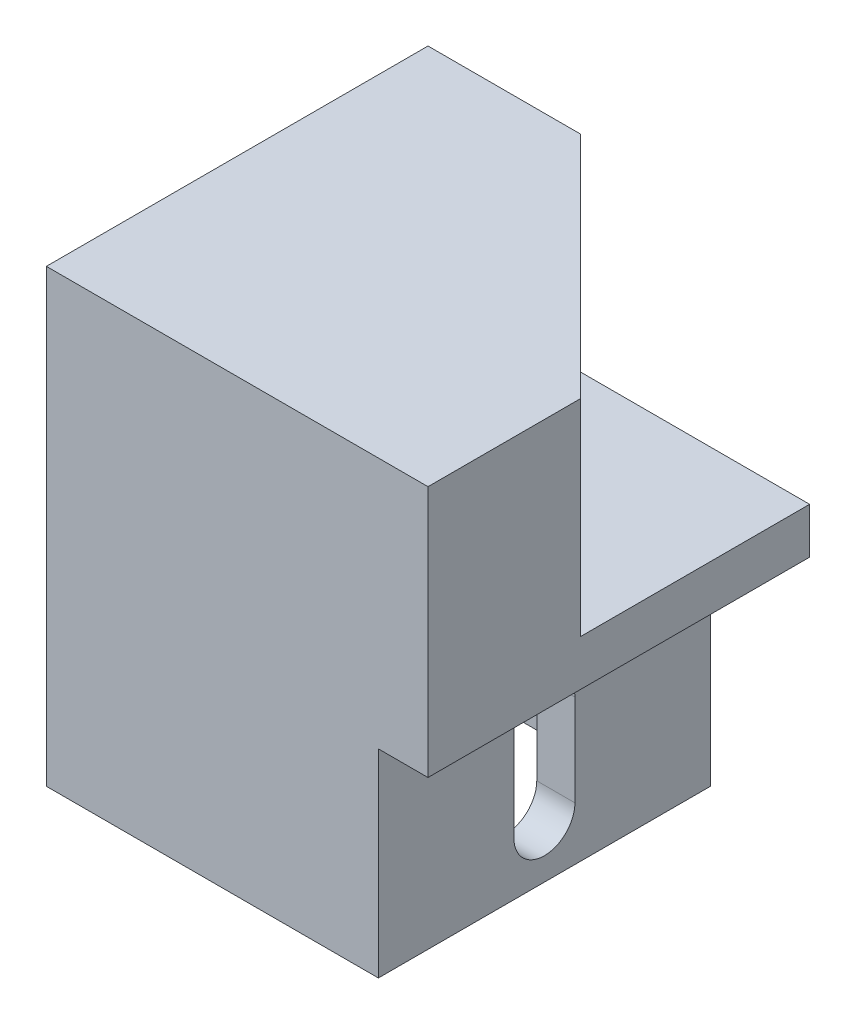
ISO-10303-21;
HEADER;
FILE_DESCRIPTION(('STEP AP214'),'2;1');
FILE_NAME('part.step','',(''),(''),'','','');
FILE_SCHEMA(('AUTOMOTIVE_DESIGN { 1 0 10303 214 1 1 1 1 }'));
ENDSEC;
DATA;
#1=APPLICATION_CONTEXT('core data for automotive mechanical design processes');
#2=APPLICATION_PROTOCOL_DEFINITION('international standard','automotive_design',2000,#1);
#3=PRODUCT_CONTEXT('',#1,'mechanical');
#4=PRODUCT('Part','Part','',(#3));
#5=PRODUCT_RELATED_PRODUCT_CATEGORY('part','',(#4));
#6=PRODUCT_DEFINITION_FORMATION('','',#4);
#7=PRODUCT_DEFINITION_CONTEXT('part definition',#1,'design');
#8=PRODUCT_DEFINITION('design','',#6,#7);
#9=PRODUCT_DEFINITION_SHAPE('','',#8);
#10=(LENGTH_UNIT() NAMED_UNIT(*) SI_UNIT(.MILLI.,.METRE.));
#11=(NAMED_UNIT(*) PLANE_ANGLE_UNIT() SI_UNIT($,.RADIAN.));
#12=(NAMED_UNIT(*) SI_UNIT($,.STERADIAN.) SOLID_ANGLE_UNIT());
#13=UNCERTAINTY_MEASURE_WITH_UNIT(LENGTH_MEASURE(1.E-05),#10,'distance_accuracy_value','');
#14=(GEOMETRIC_REPRESENTATION_CONTEXT(3) GLOBAL_UNCERTAINTY_ASSIGNED_CONTEXT((#13)) GLOBAL_UNIT_ASSIGNED_CONTEXT((#10,
#11,#12)) REPRESENTATION_CONTEXT('',''));
#15=CARTESIAN_POINT('',(0.,0.,0.));
#16=DIRECTION('',(0.,0.,1.));
#17=DIRECTION('',(1.,0.,0.));
#18=AXIS2_PLACEMENT_3D('',#15,#16,#17);
#19=CARTESIAN_POINT('',(0.,5.75,-15.));
#20=DIRECTION('',(-1.,0.,0.));
#21=DIRECTION('',(0.,0.,1.));
#22=AXIS2_PLACEMENT_3D('',#19,#20,#21);
#23=PLANE('',#22);
#24=DIRECTION('',(0.,0.,-1.));
#25=VECTOR('',#24,1.);
#26=CARTESIAN_POINT('',(0.,-5.75,-15.));
#27=LINE('',#26,#25);
#28=CARTESIAN_POINT('',(0.,-5.75,0.));
#29=VERTEX_POINT('',#28);
#30=CARTESIAN_POINT('',(0.,-5.75,-15.));
#31=VERTEX_POINT('',#30);
#32=EDGE_CURVE('E328',#29,#31,#27,.T.);
#33=ORIENTED_EDGE('',*,*,#32,.T.);
#34=DIRECTION('',(0.,-1.,0.));
#35=VECTOR('',#34,1.);
#36=CARTESIAN_POINT('',(0.,5.75,-15.));
#37=LINE('',#36,#35);
#38=CARTESIAN_POINT('',(0.,5.75,-15.));
#39=VERTEX_POINT('',#38);
#40=EDGE_CURVE('E351',#39,#31,#37,.T.);
#41=ORIENTED_EDGE('',*,*,#40,.F.);
#42=DIRECTION('',(0.,0.,-1.));
#43=VECTOR('',#42,1.);
#44=CARTESIAN_POINT('',(0.,5.75,-15.));
#45=LINE('',#44,#43);
#46=CARTESIAN_POINT('',(0.,5.75,0.));
#47=VERTEX_POINT('',#46);
#48=EDGE_CURVE('E329',#47,#39,#45,.T.);
#49=ORIENTED_EDGE('',*,*,#48,.F.);
#50=DIRECTION('',(0.,-1.,0.));
#51=VECTOR('',#50,1.);
#52=CARTESIAN_POINT('',(0.,5.75,0.));
#53=LINE('',#52,#51);
#54=EDGE_CURVE('E336',#47,#29,#53,.T.);
#55=ORIENTED_EDGE('',*,*,#54,.T.);
#56=EDGE_LOOP('',(#33,#41,#49,#55));
#57=FACE_BOUND('',#56,.T.);
#58=ADVANCED_FACE('F35',(#57),#23,.F.);
#59=CARTESIAN_POINT('',(-10.,5.75,-15.));
#60=DIRECTION('',(0.,0.,1.));
#61=DIRECTION('',(1.,0.,0.));
#62=AXIS2_PLACEMENT_3D('',#59,#60,#61);
#63=PLANE('',#62);
#64=ORIENTED_EDGE('',*,*,#40,.T.);
#65=DIRECTION('',(1.,0.,0.));
#66=VECTOR('',#65,1.);
#67=CARTESIAN_POINT('',(-10.,-5.75,-15.));
#68=LINE('',#67,#66);
#69=CARTESIAN_POINT('',(15.,-5.75,-15.));
#70=VERTEX_POINT('',#69);
#71=EDGE_CURVE('E312',#31,#70,#68,.T.);
#72=ORIENTED_EDGE('',*,*,#71,.T.);
#73=DIRECTION('',(0.,1.,0.));
#74=VECTOR('',#73,1.);
#75=CARTESIAN_POINT('',(15.,-8.75,-15.));
#76=LINE('',#75,#74);
#77=CARTESIAN_POINT('',(15.,-8.75,-15.));
#78=VERTEX_POINT('',#77);
#79=EDGE_CURVE('E323',#78,#70,#76,.T.);
#80=ORIENTED_EDGE('',*,*,#79,.F.);
#81=DIRECTION('',(1.,0.,0.));
#82=VECTOR('',#81,1.);
#83=CARTESIAN_POINT('',(-10.,-8.75,-15.));
#84=LINE('',#83,#82);
#85=CARTESIAN_POINT('',(-10.,-8.75,-15.));
#86=VERTEX_POINT('',#85);
#87=EDGE_CURVE('E315',#86,#78,#84,.T.);
#88=ORIENTED_EDGE('',*,*,#87,.F.);
#89=DIRECTION('',(0.,-1.,0.));
#90=VECTOR('',#89,1.);
#91=CARTESIAN_POINT('',(-10.,5.75,-15.));
#92=LINE('',#91,#90);
#93=CARTESIAN_POINT('',(-10.,7.75,-15.));
#94=VERTEX_POINT('',#93);
#95=EDGE_CURVE('E348',#94,#86,#92,.T.);
#96=ORIENTED_EDGE('',*,*,#95,.F.);
#97=DIRECTION('',(-1.,0.,0.));
#98=VECTOR('',#97,1.);
#99=CARTESIAN_POINT('',(0.,7.75,-15.));
#100=LINE('',#99,#98);
#101=CARTESIAN_POINT('',(0.,7.75,-15.));
#102=VERTEX_POINT('',#101);
#103=EDGE_CURVE('E200',#102,#94,#100,.T.);
#104=ORIENTED_EDGE('',*,*,#103,.F.);
#105=DIRECTION('',(0.,-1.,0.));
#106=VECTOR('',#105,1.);
#107=CARTESIAN_POINT('',(0.,7.75,-15.));
#108=LINE('',#107,#106);
#109=EDGE_CURVE('E196',#102,#39,#108,.T.);
#110=ORIENTED_EDGE('',*,*,#109,.T.);
#111=EDGE_LOOP('',(#64,#72,#80,#88,#96,#104,#110));
#112=FACE_BOUND('',#111,.T.);
#113=ADVANCED_FACE('F401',(#112),#63,.F.);
#114=CARTESIAN_POINT('',(-10.,5.75,10.));
#115=DIRECTION('',(1.,0.,0.));
#116=DIRECTION('',(0.,0.,-1.));
#117=AXIS2_PLACEMENT_3D('',#114,#115,#116);
#118=PLANE('',#117);
#119=ORIENTED_EDGE('',*,*,#95,.T.);
#120=DIRECTION('',(0.,0.,-1.));
#121=VECTOR('',#120,1.);
#122=CARTESIAN_POINT('',(-10.,-8.75,10.));
#123=LINE('',#122,#121);
#124=CARTESIAN_POINT('',(-10.,-8.75,-11.75));
#125=VERTEX_POINT('',#124);
#126=EDGE_CURVE('E313',#125,#86,#123,.T.);
#127=ORIENTED_EDGE('',*,*,#126,.F.);
#128=DIRECTION('',(0.,1.,0.));
#129=VECTOR('',#128,1.);
#130=CARTESIAN_POINT('',(-9.99999999999999,-21.75,-11.75));
#131=LINE('',#130,#129);
#132=CARTESIAN_POINT('',(-9.99999999999999,-21.75,-11.75));
#133=VERTEX_POINT('',#132);
#134=EDGE_CURVE('E309',#133,#125,#131,.T.);
#135=ORIENTED_EDGE('',*,*,#134,.F.);
#136=DIRECTION('',(0.,0.,-1.));
#137=VECTOR('',#136,1.);
#138=CARTESIAN_POINT('',(-10.,-21.75,10.));
#139=LINE('',#138,#137);
#140=CARTESIAN_POINT('',(-10.,-21.75,10.));
#141=VERTEX_POINT('',#140);
#142=EDGE_CURVE('E288',#141,#133,#139,.T.);
#143=ORIENTED_EDGE('',*,*,#142,.F.);
#144=DIRECTION('',(0.,-1.,0.));
#145=VECTOR('',#144,1.);
#146=CARTESIAN_POINT('',(-10.,5.75,10.));
#147=LINE('',#146,#145);
#148=CARTESIAN_POINT('',(-10.,7.75,10.));
#149=VERTEX_POINT('',#148);
#150=EDGE_CURVE('E346',#149,#141,#147,.T.);
#151=ORIENTED_EDGE('',*,*,#150,.F.);
#152=DIRECTION('',(0.,0.,1.));
#153=VECTOR('',#152,1.);
#154=CARTESIAN_POINT('',(-10.,7.75,0.));
#155=LINE('',#154,#153);
#156=EDGE_CURVE('E419',#94,#149,#155,.T.);
#157=ORIENTED_EDGE('',*,*,#156,.F.);
#158=EDGE_LOOP('',(#119,#127,#135,#143,#151,#157));
#159=FACE_BOUND('',#158,.T.);
#160=ADVANCED_FACE('F406',(#159),#118,.F.);
#161=CARTESIAN_POINT('',(15.,5.75,10.));
#162=DIRECTION('',(0.,0.,-1.));
#163=DIRECTION('',(-1.,0.,0.));
#164=AXIS2_PLACEMENT_3D('',#161,#162,#163);
#165=PLANE('',#164);
#166=ORIENTED_EDGE('',*,*,#150,.T.);
#167=DIRECTION('',(-1.,0.,0.));
#168=VECTOR('',#167,1.);
#169=CARTESIAN_POINT('',(-10.,-21.75,10.));
#170=LINE('',#169,#168);
#171=CARTESIAN_POINT('',(11.75,-21.75,10.));
#172=VERTEX_POINT('',#171);
#173=EDGE_CURVE('E296',#172,#141,#170,.T.);
#174=ORIENTED_EDGE('',*,*,#173,.F.);
#175=DIRECTION('',(0.,1.,0.));
#176=VECTOR('',#175,1.);
#177=CARTESIAN_POINT('',(11.75,-21.75,10.));
#178=LINE('',#177,#176);
#179=CARTESIAN_POINT('',(11.75,-8.75,10.));
#180=VERTEX_POINT('',#179);
#181=EDGE_CURVE('E299',#172,#180,#178,.T.);
#182=ORIENTED_EDGE('',*,*,#181,.T.);
#183=DIRECTION('',(-1.,0.,0.));
#184=VECTOR('',#183,1.);
#185=CARTESIAN_POINT('',(-10.,-8.75,10.));
#186=LINE('',#185,#184);
#187=CARTESIAN_POINT('',(15.,-8.75,10.));
#188=VERTEX_POINT('',#187);
#189=EDGE_CURVE('E321',#188,#180,#186,.T.);
#190=ORIENTED_EDGE('',*,*,#189,.F.);
#191=DIRECTION('',(0.,-1.,0.));
#192=VECTOR('',#191,1.);
#193=CARTESIAN_POINT('',(15.,5.75,10.));
#194=LINE('',#193,#192);
#195=CARTESIAN_POINT('',(15.,7.75,10.));
#196=VERTEX_POINT('',#195);
#197=EDGE_CURVE('E344',#196,#188,#194,.T.);
#198=ORIENTED_EDGE('',*,*,#197,.F.);
#199=DIRECTION('',(1.,0.,0.));
#200=VECTOR('',#199,1.);
#201=CARTESIAN_POINT('',(0.,7.75,10.));
#202=LINE('',#201,#200);
#203=EDGE_CURVE('E208',#149,#196,#202,.T.);
#204=ORIENTED_EDGE('',*,*,#203,.F.);
#205=EDGE_LOOP('',(#166,#174,#182,#190,#198,#204));
#206=FACE_BOUND('',#205,.T.);
#207=ADVANCED_FACE('F429',(#206),#165,.F.);
#208=CARTESIAN_POINT('',(15.,5.75,0.));
#209=DIRECTION('',(-1.,0.,0.));
#210=DIRECTION('',(0.,0.,1.));
#211=AXIS2_PLACEMENT_3D('',#208,#209,#210);
#212=PLANE('',#211);
#213=ORIENTED_EDGE('',*,*,#197,.T.);
#214=DIRECTION('',(0.,0.,1.));
#215=VECTOR('',#214,1.);
#216=CARTESIAN_POINT('',(15.,-8.75,10.));
#217=LINE('',#216,#215);
#218=EDGE_CURVE('E318',#78,#188,#217,.T.);
#219=ORIENTED_EDGE('',*,*,#218,.F.);
#220=ORIENTED_EDGE('',*,*,#79,.T.);
#221=DIRECTION('',(0.,0.,1.));
#222=VECTOR('',#221,1.);
#223=CARTESIAN_POINT('',(15.,-5.75,10.));
#224=LINE('',#223,#222);
#225=CARTESIAN_POINT('',(15.,-5.75,0.));
#226=VERTEX_POINT('',#225);
#227=EDGE_CURVE('E316',#70,#226,#224,.T.);
#228=ORIENTED_EDGE('',*,*,#227,.T.);
#229=DIRECTION('',(0.,-1.,0.));
#230=VECTOR('',#229,1.);
#231=CARTESIAN_POINT('',(15.,5.75,0.));
#232=LINE('',#231,#230);
#233=CARTESIAN_POINT('',(15.,5.75,0.));
#234=VERTEX_POINT('',#233);
#235=EDGE_CURVE('E215',#234,#226,#232,.T.);
#236=ORIENTED_EDGE('',*,*,#235,.F.);
#237=DIRECTION('',(0.,-1.,0.));
#238=VECTOR('',#237,1.);
#239=CARTESIAN_POINT('',(15.,7.75,0.));
#240=LINE('',#239,#238);
#241=CARTESIAN_POINT('',(15.,7.75,0.));
#242=VERTEX_POINT('',#241);
#243=EDGE_CURVE('E194',#242,#234,#240,.T.);
#244=ORIENTED_EDGE('',*,*,#243,.F.);
#245=DIRECTION('',(0.,0.,-1.));
#246=VECTOR('',#245,1.);
#247=CARTESIAN_POINT('',(15.,7.75,0.));
#248=LINE('',#247,#246);
#249=EDGE_CURVE('E201',#196,#242,#248,.T.);
#250=ORIENTED_EDGE('',*,*,#249,.F.);
#251=EDGE_LOOP('',(#213,#219,#220,#228,#236,#244,#250));
#252=FACE_BOUND('',#251,.T.);
#253=ADVANCED_FACE('F212',(#252),#212,.F.);
#254=CARTESIAN_POINT('',(0.,5.75,0.));
#255=DIRECTION('',(0.,0.,1.));
#256=DIRECTION('',(1.,0.,0.));
#257=AXIS2_PLACEMENT_3D('',#254,#255,#256);
#258=PLANE('',#257);
#259=DIRECTION('',(-1.,0.,0.));
#260=VECTOR('',#259,1.);
#261=CARTESIAN_POINT('',(0.,-5.75,0.));
#262=LINE('',#261,#260);
#263=EDGE_CURVE('E333',#226,#29,#262,.T.);
#264=ORIENTED_EDGE('',*,*,#263,.T.);
#265=ORIENTED_EDGE('',*,*,#54,.F.);
#266=DIRECTION('',(-1.,0.,0.));
#267=VECTOR('',#266,1.);
#268=CARTESIAN_POINT('',(0.,5.75,0.));
#269=LINE('',#268,#267);
#270=EDGE_CURVE('E332',#234,#47,#269,.T.);
#271=ORIENTED_EDGE('',*,*,#270,.F.);
#272=ORIENTED_EDGE('',*,*,#235,.T.);
#273=EDGE_LOOP('',(#264,#265,#271,#272));
#274=FACE_BOUND('',#273,.T.);
#275=ADVANCED_FACE('F413',(#274),#258,.F.);
#276=CARTESIAN_POINT('',(0.,-8.75,0.));
#277=DIRECTION('',(0.,-1.,0.));
#278=DIRECTION('',(0.,0.,-1.));
#279=AXIS2_PLACEMENT_3D('',#276,#277,#278);
#280=PLANE('',#279);
#281=DIRECTION('',(0.,0.,1.));
#282=VECTOR('',#281,1.);
#283=CARTESIAN_POINT('',(11.75,-8.75,10.));
#284=LINE('',#283,#282);
#285=CARTESIAN_POINT('',(11.75,-8.75,-11.75));
#286=VERTEX_POINT('',#285);
#287=EDGE_CURVE('E292',#286,#180,#284,.T.);
#288=ORIENTED_EDGE('',*,*,#287,.F.);
#289=DIRECTION('',(1.,0.,0.));
#290=VECTOR('',#289,1.);
#291=CARTESIAN_POINT('',(-9.99999999999999,-8.75,-11.75));
#292=LINE('',#291,#290);
#293=EDGE_CURVE('E287',#125,#286,#292,.T.);
#294=ORIENTED_EDGE('',*,*,#293,.F.);
#295=ORIENTED_EDGE('',*,*,#126,.T.);
#296=ORIENTED_EDGE('',*,*,#87,.T.);
#297=ORIENTED_EDGE('',*,*,#218,.T.);
#298=ORIENTED_EDGE('',*,*,#189,.T.);
#299=EDGE_LOOP('',(#288,#294,#295,#296,#297,#298));
#300=FACE_BOUND('',#299,.T.);
#301=ADVANCED_FACE('F440',(#300),#280,.T.);
#302=CARTESIAN_POINT('',(0.,-5.75,0.));
#303=DIRECTION('',(0.,-1.,0.));
#304=DIRECTION('',(0.,0.,-1.));
#305=AXIS2_PLACEMENT_3D('',#302,#303,#304);
#306=PLANE('',#305);
#307=ORIENTED_EDGE('',*,*,#32,.F.);
#308=ORIENTED_EDGE('',*,*,#263,.F.);
#309=ORIENTED_EDGE('',*,*,#227,.F.);
#310=ORIENTED_EDGE('',*,*,#71,.F.);
#311=EDGE_LOOP('',(#307,#308,#309,#310));
#312=FACE_BOUND('',#311,.T.);
#313=ADVANCED_FACE('F410',(#312),#306,.F.);
#314=CARTESIAN_POINT('',(0.,-21.75,0.));
#315=DIRECTION('',(0.,-1.,0.));
#316=DIRECTION('',(0.,0.,-1.));
#317=AXIS2_PLACEMENT_3D('',#314,#315,#316);
#318=PLANE('',#317);
#319=ORIENTED_EDGE('',*,*,#142,.T.);
#320=DIRECTION('',(1.,0.,0.));
#321=VECTOR('',#320,1.);
#322=CARTESIAN_POINT('',(-9.99999999999999,-21.75,-11.75));
#323=LINE('',#322,#321);
#324=CARTESIAN_POINT('',(11.75,-21.75,-11.75));
#325=VERTEX_POINT('',#324);
#326=EDGE_CURVE('E291',#133,#325,#323,.T.);
#327=ORIENTED_EDGE('',*,*,#326,.T.);
#328=DIRECTION('',(0.,0.,1.));
#329=VECTOR('',#328,1.);
#330=CARTESIAN_POINT('',(11.75,-21.75,10.));
#331=LINE('',#330,#329);
#332=EDGE_CURVE('E294',#325,#172,#331,.T.);
#333=ORIENTED_EDGE('',*,*,#332,.T.);
#334=ORIENTED_EDGE('',*,*,#173,.T.);
#335=EDGE_LOOP('',(#319,#327,#333,#334));
#336=FACE_BOUND('',#335,.T.);
#337=DIRECTION('',(-1.,0.,0.));
#338=VECTOR('',#337,1.);
#339=CARTESIAN_POINT('',(-4.25,-21.75,4.25000000000001));
#340=LINE('',#339,#338);
#341=CARTESIAN_POINT('',(9.25000000000001,-21.75,4.25000000000001));
#342=VERTEX_POINT('',#341);
#343=CARTESIAN_POINT('',(-4.25,-21.75,4.25000000000001));
#344=VERTEX_POINT('',#343);
#345=EDGE_CURVE('E260',#342,#344,#340,.T.);
#346=ORIENTED_EDGE('',*,*,#345,.F.);
#347=DIRECTION('',(0.,0.,1.));
#348=VECTOR('',#347,1.);
#349=CARTESIAN_POINT('',(9.25000000000001,-21.75,-9.24999999999999));
#350=LINE('',#349,#348);
#351=CARTESIAN_POINT('',(9.25000000000001,-21.75,-9.24999999999999));
#352=VERTEX_POINT('',#351);
#353=EDGE_CURVE('E258',#352,#342,#350,.T.);
#354=ORIENTED_EDGE('',*,*,#353,.F.);
#355=DIRECTION('',(1.,0.,0.));
#356=VECTOR('',#355,1.);
#357=CARTESIAN_POINT('',(-4.25,-21.75,-9.24999999999999));
#358=LINE('',#357,#356);
#359=CARTESIAN_POINT('',(-4.25,-21.75,-9.24999999999999));
#360=VERTEX_POINT('',#359);
#361=EDGE_CURVE('E266',#360,#352,#358,.T.);
#362=ORIENTED_EDGE('',*,*,#361,.F.);
#363=DIRECTION('',(0.,0.,-1.));
#364=VECTOR('',#363,1.);
#365=CARTESIAN_POINT('',(-4.25,-21.75,-9.24999999999999));
#366=LINE('',#365,#364);
#367=EDGE_CURVE('E263',#344,#360,#366,.T.);
#368=ORIENTED_EDGE('',*,*,#367,.F.);
#369=EDGE_LOOP('',(#346,#354,#362,#368));
#370=FACE_BOUND('',#369,.T.);
#371=ADVANCED_FACE('F431',(#336,#370),#318,.T.);
#372=CARTESIAN_POINT('',(-9.99999999999999,-21.75,-11.75));
#373=DIRECTION('',(0.,0.,1.));
#374=DIRECTION('',(1.,0.,0.));
#375=AXIS2_PLACEMENT_3D('',#372,#373,#374);
#376=PLANE('',#375);
#377=DIRECTION('',(0.,-1.,0.));
#378=VECTOR('',#377,1.);
#379=CARTESIAN_POINT('',(2.87500000000001,-12.25,-11.75));
#380=LINE('',#379,#378);
#381=CARTESIAN_POINT('',(2.87500000000001,-12.25,-11.75));
#382=VERTEX_POINT('',#381);
#383=CARTESIAN_POINT('',(2.87500000000001,-18.25,-11.75));
#384=VERTEX_POINT('',#383);
#385=EDGE_CURVE('E218',#382,#384,#380,.T.);
#386=ORIENTED_EDGE('',*,*,#385,.F.);
#387=CARTESIAN_POINT('',(0.875000000000006,-12.25,-11.75));
#388=DIRECTION('',(0.,0.,-1.));
#389=DIRECTION('',(-1.,0.,0.));
#390=AXIS2_PLACEMENT_3D('',#387,#388,#389);
#391=CIRCLE('',#390,2.);
#392=CARTESIAN_POINT('',(-1.12499999999999,-12.25,-11.75));
#393=VERTEX_POINT('',#392);
#394=EDGE_CURVE('E49',#393,#382,#391,.T.);
#395=ORIENTED_EDGE('',*,*,#394,.F.);
#396=DIRECTION('',(0.,-1.,0.));
#397=VECTOR('',#396,1.);
#398=CARTESIAN_POINT('',(-1.12499999999999,-12.25,-11.75));
#399=LINE('',#398,#397);
#400=CARTESIAN_POINT('',(-1.12499999999999,-18.25,-11.75));
#401=VERTEX_POINT('',#400);
#402=EDGE_CURVE('E227',#393,#401,#399,.T.);
#403=ORIENTED_EDGE('',*,*,#402,.T.);
#404=CARTESIAN_POINT('',(0.875000000000006,-18.25,-11.75));
#405=DIRECTION('',(0.,0.,-1.));
#406=DIRECTION('',(-1.,0.,0.));
#407=AXIS2_PLACEMENT_3D('',#404,#405,#406);
#408=CIRCLE('',#407,2.);
#409=EDGE_CURVE('E224',#384,#401,#408,.T.);
#410=ORIENTED_EDGE('',*,*,#409,.F.);
#411=EDGE_LOOP('',(#386,#395,#403,#410));
#412=FACE_BOUND('',#411,.T.);
#413=ORIENTED_EDGE('',*,*,#293,.T.);
#414=DIRECTION('',(0.,1.,0.));
#415=VECTOR('',#414,1.);
#416=CARTESIAN_POINT('',(11.75,-21.75,-11.75));
#417=LINE('',#416,#415);
#418=EDGE_CURVE('E306',#325,#286,#417,.T.);
#419=ORIENTED_EDGE('',*,*,#418,.F.);
#420=ORIENTED_EDGE('',*,*,#326,.F.);
#421=ORIENTED_EDGE('',*,*,#134,.T.);
#422=EDGE_LOOP('',(#413,#419,#420,#421));
#423=FACE_BOUND('',#422,.T.);
#424=ADVANCED_FACE('F383',(#412,#423),#376,.F.);
#425=CARTESIAN_POINT('',(11.75,-21.75,10.));
#426=DIRECTION('',(-1.,0.,0.));
#427=DIRECTION('',(0.,0.,1.));
#428=AXIS2_PLACEMENT_3D('',#425,#426,#427);
#429=PLANE('',#428);
#430=CARTESIAN_POINT('',(11.75,-18.25,-0.874999999999992));
#431=DIRECTION('',(1.,0.,0.));
#432=DIRECTION('',(0.,0.,-1.));
#433=AXIS2_PLACEMENT_3D('',#430,#431,#432);
#434=CIRCLE('',#433,2.);
#435=CARTESIAN_POINT('',(11.75,-18.25,1.12500000000001));
#436=VERTEX_POINT('',#435);
#437=CARTESIAN_POINT('',(11.75,-18.25,-2.87499999999999));
#438=VERTEX_POINT('',#437);
#439=EDGE_CURVE('E239',#436,#438,#434,.T.);
#440=ORIENTED_EDGE('',*,*,#439,.F.);
#441=DIRECTION('',(0.,-1.,0.));
#442=VECTOR('',#441,1.);
#443=CARTESIAN_POINT('',(11.75,0.,1.12500000000001));
#444=LINE('',#443,#442);
#445=CARTESIAN_POINT('',(11.75,-12.25,1.12500000000001));
#446=VERTEX_POINT('',#445);
#447=EDGE_CURVE('E233',#446,#436,#444,.T.);
#448=ORIENTED_EDGE('',*,*,#447,.F.);
#449=CARTESIAN_POINT('',(11.75,-12.25,-0.874999999999992));
#450=DIRECTION('',(1.,0.,0.));
#451=DIRECTION('',(0.,0.,-1.));
#452=AXIS2_PLACEMENT_3D('',#449,#450,#451);
#453=CIRCLE('',#452,2.);
#454=CARTESIAN_POINT('',(11.75,-12.25,-2.87499999999999));
#455=VERTEX_POINT('',#454);
#456=EDGE_CURVE('E245',#455,#446,#453,.T.);
#457=ORIENTED_EDGE('',*,*,#456,.F.);
#458=DIRECTION('',(0.,-1.,0.));
#459=VECTOR('',#458,1.);
#460=CARTESIAN_POINT('',(11.75,0.,-2.87499999999999));
#461=LINE('',#460,#459);
#462=EDGE_CURVE('E242',#455,#438,#461,.T.);
#463=ORIENTED_EDGE('',*,*,#462,.T.);
#464=EDGE_LOOP('',(#440,#448,#457,#463));
#465=FACE_BOUND('',#464,.T.);
#466=ORIENTED_EDGE('',*,*,#287,.T.);
#467=ORIENTED_EDGE('',*,*,#181,.F.);
#468=ORIENTED_EDGE('',*,*,#332,.F.);
#469=ORIENTED_EDGE('',*,*,#418,.T.);
#470=EDGE_LOOP('',(#466,#467,#468,#469));
#471=FACE_BOUND('',#470,.T.);
#472=ADVANCED_FACE('F437',(#465,#471),#429,.F.);
#473=CARTESIAN_POINT('',(9.25000000000001,-21.75,-9.24999999999999));
#474=DIRECTION('',(-1.,0.,0.));
#475=DIRECTION('',(0.,0.,1.));
#476=AXIS2_PLACEMENT_3D('',#473,#474,#475);
#477=PLANE('',#476);
#478=DIRECTION('',(0.,1.,0.));
#479=VECTOR('',#478,1.);
#480=CARTESIAN_POINT('',(9.25000000000001,-21.75,1.12500000000001));
#481=LINE('',#480,#479);
#482=CARTESIAN_POINT('',(9.25000000000001,-18.25,1.12500000000001));
#483=VERTEX_POINT('',#482);
#484=CARTESIAN_POINT('',(9.25000000000001,-12.25,1.12500000000001));
#485=VERTEX_POINT('',#484);
#486=EDGE_CURVE('E361',#483,#485,#481,.T.);
#487=ORIENTED_EDGE('',*,*,#486,.F.);
#488=CARTESIAN_POINT('',(9.25000000000001,-18.25,-0.874999999999992));
#489=DIRECTION('',(-1.,0.,0.));
#490=DIRECTION('',(0.,0.,1.));
#491=AXIS2_PLACEMENT_3D('',#488,#489,#490);
#492=CIRCLE('',#491,2.);
#493=CARTESIAN_POINT('',(9.25000000000001,-18.25,-2.87499999999999));
#494=VERTEX_POINT('',#493);
#495=EDGE_CURVE('E354',#494,#483,#492,.T.);
#496=ORIENTED_EDGE('',*,*,#495,.F.);
#497=DIRECTION('',(0.,1.,0.));
#498=VECTOR('',#497,1.);
#499=CARTESIAN_POINT('',(9.25000000000001,-21.75,-2.87499999999999));
#500=LINE('',#499,#498);
#501=CARTESIAN_POINT('',(9.25000000000001,-12.25,-2.87499999999999));
#502=VERTEX_POINT('',#501);
#503=EDGE_CURVE('E356',#494,#502,#500,.T.);
#504=ORIENTED_EDGE('',*,*,#503,.T.);
#505=CARTESIAN_POINT('',(9.25000000000001,-12.25,-0.874999999999992));
#506=DIRECTION('',(-1.,0.,0.));
#507=DIRECTION('',(0.,0.,1.));
#508=AXIS2_PLACEMENT_3D('',#505,#506,#507);
#509=CIRCLE('',#508,2.);
#510=EDGE_CURVE('E359',#485,#502,#509,.T.);
#511=ORIENTED_EDGE('',*,*,#510,.F.);
#512=EDGE_LOOP('',(#487,#496,#504,#511));
#513=FACE_BOUND('',#512,.T.);
#514=DIRECTION('',(0.,0.,1.));
#515=VECTOR('',#514,1.);
#516=CARTESIAN_POINT('',(9.25000000000001,-8.75,-9.24999999999999));
#517=LINE('',#516,#515);
#518=CARTESIAN_POINT('',(9.25000000000001,-8.75,-9.24999999999999));
#519=VERTEX_POINT('',#518);
#520=CARTESIAN_POINT('',(9.25000000000001,-8.75,4.25000000000001));
#521=VERTEX_POINT('',#520);
#522=EDGE_CURVE('E251',#519,#521,#517,.T.);
#523=ORIENTED_EDGE('',*,*,#522,.F.);
#524=DIRECTION('',(0.,1.,0.));
#525=VECTOR('',#524,1.);
#526=CARTESIAN_POINT('',(9.25000000000001,-21.75,-9.24999999999999));
#527=LINE('',#526,#525);
#528=EDGE_CURVE('E268',#352,#519,#527,.T.);
#529=ORIENTED_EDGE('',*,*,#528,.F.);
#530=ORIENTED_EDGE('',*,*,#353,.T.);
#531=DIRECTION('',(0.,1.,0.));
#532=VECTOR('',#531,1.);
#533=CARTESIAN_POINT('',(9.25000000000001,-21.75,4.25000000000001));
#534=LINE('',#533,#532);
#535=EDGE_CURVE('E284',#342,#521,#534,.T.);
#536=ORIENTED_EDGE('',*,*,#535,.T.);
#537=EDGE_LOOP('',(#523,#529,#530,#536));
#538=FACE_BOUND('',#537,.T.);
#539=ADVANCED_FACE('F449',(#513,#538),#477,.T.);
#540=CARTESIAN_POINT('',(-4.25,-21.75,4.25000000000001));
#541=DIRECTION('',(0.,0.,-1.));
#542=DIRECTION('',(-1.,0.,0.));
#543=AXIS2_PLACEMENT_3D('',#540,#541,#542);
#544=PLANE('',#543);
#545=DIRECTION('',(-1.,0.,0.));
#546=VECTOR('',#545,1.);
#547=CARTESIAN_POINT('',(-4.25,-8.75,4.25000000000001));
#548=LINE('',#547,#546);
#549=CARTESIAN_POINT('',(-4.25,-8.75,4.25000000000001));
#550=VERTEX_POINT('',#549);
#551=EDGE_CURVE('E271',#521,#550,#548,.T.);
#552=ORIENTED_EDGE('',*,*,#551,.F.);
#553=ORIENTED_EDGE('',*,*,#535,.F.);
#554=ORIENTED_EDGE('',*,*,#345,.T.);
#555=DIRECTION('',(0.,1.,0.));
#556=VECTOR('',#555,1.);
#557=CARTESIAN_POINT('',(-4.25,-21.75,4.25000000000001));
#558=LINE('',#557,#556);
#559=EDGE_CURVE('E282',#344,#550,#558,.T.);
#560=ORIENTED_EDGE('',*,*,#559,.T.);
#561=EDGE_LOOP('',(#552,#553,#554,#560));
#562=FACE_BOUND('',#561,.T.);
#563=ADVANCED_FACE('F502',(#562),#544,.T.);
#564=CARTESIAN_POINT('',(-4.25,-21.75,-9.24999999999999));
#565=DIRECTION('',(1.,0.,0.));
#566=DIRECTION('',(0.,0.,-1.));
#567=AXIS2_PLACEMENT_3D('',#564,#565,#566);
#568=PLANE('',#567);
#569=DIRECTION('',(0.,0.,-1.));
#570=VECTOR('',#569,1.);
#571=CARTESIAN_POINT('',(-4.25,-8.75,-9.24999999999999));
#572=LINE('',#571,#570);
#573=CARTESIAN_POINT('',(-4.25,-8.75,-9.24999999999999));
#574=VERTEX_POINT('',#573);
#575=EDGE_CURVE('E274',#550,#574,#572,.T.);
#576=ORIENTED_EDGE('',*,*,#575,.F.);
#577=ORIENTED_EDGE('',*,*,#559,.F.);
#578=ORIENTED_EDGE('',*,*,#367,.T.);
#579=DIRECTION('',(0.,1.,0.));
#580=VECTOR('',#579,1.);
#581=CARTESIAN_POINT('',(-4.25,-21.75,-9.24999999999999));
#582=LINE('',#581,#580);
#583=EDGE_CURVE('E280',#360,#574,#582,.T.);
#584=ORIENTED_EDGE('',*,*,#583,.T.);
#585=EDGE_LOOP('',(#576,#577,#578,#584));
#586=FACE_BOUND('',#585,.T.);
#587=ADVANCED_FACE('F507',(#586),#568,.T.);
#588=CARTESIAN_POINT('',(-4.25,-21.75,-9.24999999999999));
#589=DIRECTION('',(0.,0.,1.));
#590=DIRECTION('',(1.,0.,0.));
#591=AXIS2_PLACEMENT_3D('',#588,#589,#590);
#592=PLANE('',#591);
#593=CARTESIAN_POINT('',(0.875000000000006,-12.25,-9.24999999999999));
#594=DIRECTION('',(0.,0.,1.));
#595=DIRECTION('',(1.,0.,0.));
#596=AXIS2_PLACEMENT_3D('',#593,#594,#595);
#597=CIRCLE('',#596,2.);
#598=CARTESIAN_POINT('',(2.87500000000001,-12.25,-9.24999999999999));
#599=VERTEX_POINT('',#598);
#600=CARTESIAN_POINT('',(-1.12499999999999,-12.25,-9.24999999999999));
#601=VERTEX_POINT('',#600);
#602=EDGE_CURVE('E11',#599,#601,#597,.T.);
#603=ORIENTED_EDGE('',*,*,#602,.F.);
#604=DIRECTION('',(0.,1.,0.));
#605=VECTOR('',#604,1.);
#606=CARTESIAN_POINT('',(2.87500000000001,-21.75,-9.24999999999999));
#607=LINE('',#606,#605);
#608=CARTESIAN_POINT('',(2.87500000000001,-18.25,-9.24999999999999));
#609=VERTEX_POINT('',#608);
#610=EDGE_CURVE('E363',#609,#599,#607,.T.);
#611=ORIENTED_EDGE('',*,*,#610,.F.);
#612=CARTESIAN_POINT('',(0.875000000000006,-18.25,-9.24999999999999));
#613=DIRECTION('',(0.,0.,1.));
#614=DIRECTION('',(1.,0.,0.));
#615=AXIS2_PLACEMENT_3D('',#612,#613,#614);
#616=CIRCLE('',#615,2.);
#617=CARTESIAN_POINT('',(-1.12499999999999,-18.25,-9.24999999999999));
#618=VERTEX_POINT('',#617);
#619=EDGE_CURVE('E365',#618,#609,#616,.T.);
#620=ORIENTED_EDGE('',*,*,#619,.F.);
#621=DIRECTION('',(0.,1.,0.));
#622=VECTOR('',#621,1.);
#623=CARTESIAN_POINT('',(-1.12499999999999,-21.75,-9.24999999999999));
#624=LINE('',#623,#622);
#625=EDGE_CURVE('E42',#618,#601,#624,.T.);
#626=ORIENTED_EDGE('',*,*,#625,.T.);
#627=EDGE_LOOP('',(#603,#611,#620,#626));
#628=FACE_BOUND('',#627,.T.);
#629=DIRECTION('',(1.,0.,0.));
#630=VECTOR('',#629,1.);
#631=CARTESIAN_POINT('',(-4.25,-8.75,-9.24999999999999));
#632=LINE('',#631,#630);
#633=EDGE_CURVE('E261',#574,#519,#632,.T.);
#634=ORIENTED_EDGE('',*,*,#633,.F.);
#635=ORIENTED_EDGE('',*,*,#583,.F.);
#636=ORIENTED_EDGE('',*,*,#361,.T.);
#637=ORIENTED_EDGE('',*,*,#528,.T.);
#638=EDGE_LOOP('',(#634,#635,#636,#637));
#639=FACE_BOUND('',#638,.T.);
#640=ADVANCED_FACE('F370',(#628,#639),#592,.T.);
#641=ORIENTED_EDGE('',*,*,#633,.T.);
#642=ORIENTED_EDGE('',*,*,#522,.T.);
#643=ORIENTED_EDGE('',*,*,#551,.T.);
#644=ORIENTED_EDGE('',*,*,#575,.T.);
#645=EDGE_LOOP('',(#641,#642,#643,#644));
#646=FACE_BOUND('',#645,.T.);
#647=ADVANCED_FACE('F456',(#646),#280,.T.);
#648=CARTESIAN_POINT('',(-1.24999999999999,0.,1.125));
#649=DIRECTION('',(0.,0.,1.));
#650=DIRECTION('',(1.,0.,0.));
#651=AXIS2_PLACEMENT_3D('',#648,#649,#650);
#652=PLANE('',#651);
#653=ORIENTED_EDGE('',*,*,#486,.T.);
#654=DIRECTION('',(1.,0.,0.));
#655=VECTOR('',#654,1.);
#656=CARTESIAN_POINT('',(-1.24999999999999,-12.25,1.125));
#657=LINE('',#656,#655);
#658=EDGE_CURVE('E249',#485,#446,#657,.T.);
#659=ORIENTED_EDGE('',*,*,#658,.T.);
#660=ORIENTED_EDGE('',*,*,#447,.T.);
#661=DIRECTION('',(1.,0.,0.));
#662=VECTOR('',#661,1.);
#663=CARTESIAN_POINT('',(-1.24999999999999,-18.25,1.125));
#664=LINE('',#663,#662);
#665=EDGE_CURVE('E248',#483,#436,#664,.T.);
#666=ORIENTED_EDGE('',*,*,#665,.F.);
#667=EDGE_LOOP('',(#653,#659,#660,#666));
#668=FACE_BOUND('',#667,.T.);
#669=ADVANCED_FACE('F530',(#668),#652,.F.);
#670=CARTESIAN_POINT('',(-1.24999999999999,-12.25,-0.874999999999994));
#671=DIRECTION('',(1.,0.,0.));
#672=DIRECTION('',(0.,0.,-1.));
#673=AXIS2_PLACEMENT_3D('',#670,#671,#672);
#674=CYLINDRICAL_SURFACE('',#673,2.);
#675=ORIENTED_EDGE('',*,*,#510,.T.);
#676=DIRECTION('',(1.,0.,0.));
#677=VECTOR('',#676,1.);
#678=CARTESIAN_POINT('',(-1.24999999999999,-12.25,-2.87499999999999));
#679=LINE('',#678,#677);
#680=EDGE_CURVE('E252',#502,#455,#679,.T.);
#681=ORIENTED_EDGE('',*,*,#680,.T.);
#682=ORIENTED_EDGE('',*,*,#456,.T.);
#683=ORIENTED_EDGE('',*,*,#658,.F.);
#684=EDGE_LOOP('',(#675,#681,#682,#683));
#685=FACE_BOUND('',#684,.T.);
#686=ADVANCED_FACE('F553',(#685),#674,.F.);
#687=CARTESIAN_POINT('',(-1.24999999999999,0.,-2.87499999999999));
#688=DIRECTION('',(0.,0.,1.));
#689=DIRECTION('',(1.,0.,0.));
#690=AXIS2_PLACEMENT_3D('',#687,#688,#689);
#691=PLANE('',#690);
#692=DIRECTION('',(1.,0.,0.));
#693=VECTOR('',#692,1.);
#694=CARTESIAN_POINT('',(-1.24999999999999,-18.25,-2.87499999999999));
#695=LINE('',#694,#693);
#696=EDGE_CURVE('E254',#494,#438,#695,.T.);
#697=ORIENTED_EDGE('',*,*,#696,.T.);
#698=ORIENTED_EDGE('',*,*,#462,.F.);
#699=ORIENTED_EDGE('',*,*,#680,.F.);
#700=ORIENTED_EDGE('',*,*,#503,.F.);
#701=EDGE_LOOP('',(#697,#698,#699,#700));
#702=FACE_BOUND('',#701,.T.);
#703=ADVANCED_FACE('F395',(#702),#691,.T.);
#704=CARTESIAN_POINT('',(-1.24999999999999,-18.25,-0.874999999999994));
#705=DIRECTION('',(1.,0.,0.));
#706=DIRECTION('',(0.,0.,-1.));
#707=AXIS2_PLACEMENT_3D('',#704,#705,#706);
#708=CYLINDRICAL_SURFACE('',#707,2.);
#709=ORIENTED_EDGE('',*,*,#495,.T.);
#710=ORIENTED_EDGE('',*,*,#665,.T.);
#711=ORIENTED_EDGE('',*,*,#439,.T.);
#712=ORIENTED_EDGE('',*,*,#696,.F.);
#713=EDGE_LOOP('',(#709,#710,#711,#712));
#714=FACE_BOUND('',#713,.T.);
#715=ADVANCED_FACE('F388',(#714),#708,.F.);
#716=CARTESIAN_POINT('',(0.875000000000006,-12.25,1.25000000000001));
#717=DIRECTION('',(0.,0.,-1.));
#718=DIRECTION('',(-1.,0.,0.));
#719=AXIS2_PLACEMENT_3D('',#716,#717,#718);
#720=CYLINDRICAL_SURFACE('',#719,2.);
#721=ORIENTED_EDGE('',*,*,#602,.T.);
#722=DIRECTION('',(0.,0.,-1.));
#723=VECTOR('',#722,1.);
#724=CARTESIAN_POINT('',(-1.12499999999999,-12.25,1.25000000000001));
#725=LINE('',#724,#723);
#726=EDGE_CURVE('E231',#601,#393,#725,.T.);
#727=ORIENTED_EDGE('',*,*,#726,.T.);
#728=ORIENTED_EDGE('',*,*,#394,.T.);
#729=DIRECTION('',(0.,0.,-1.));
#730=VECTOR('',#729,1.);
#731=CARTESIAN_POINT('',(2.87500000000001,-12.25,1.25000000000001));
#732=LINE('',#731,#730);
#733=EDGE_CURVE('E230',#599,#382,#732,.T.);
#734=ORIENTED_EDGE('',*,*,#733,.F.);
#735=EDGE_LOOP('',(#721,#727,#728,#734));
#736=FACE_BOUND('',#735,.T.);
#737=ADVANCED_FACE('F386',(#736),#720,.F.);
#738=CARTESIAN_POINT('',(-1.12499999999999,-12.25,1.25000000000001));
#739=DIRECTION('',(1.,0.,0.));
#740=DIRECTION('',(0.,0.,-1.));
#741=AXIS2_PLACEMENT_3D('',#738,#739,#740);
#742=PLANE('',#741);
#743=DIRECTION('',(0.,0.,-1.));
#744=VECTOR('',#743,1.);
#745=CARTESIAN_POINT('',(-1.12499999999999,-18.25,1.25000000000001));
#746=LINE('',#745,#744);
#747=EDGE_CURVE('E234',#618,#401,#746,.T.);
#748=ORIENTED_EDGE('',*,*,#747,.T.);
#749=ORIENTED_EDGE('',*,*,#402,.F.);
#750=ORIENTED_EDGE('',*,*,#726,.F.);
#751=ORIENTED_EDGE('',*,*,#625,.F.);
#752=EDGE_LOOP('',(#748,#749,#750,#751));
#753=FACE_BOUND('',#752,.T.);
#754=ADVANCED_FACE('F376',(#753),#742,.T.);
#755=CARTESIAN_POINT('',(0.875000000000006,-18.25,1.25000000000001));
#756=DIRECTION('',(0.,0.,-1.));
#757=DIRECTION('',(-1.,0.,0.));
#758=AXIS2_PLACEMENT_3D('',#755,#756,#757);
#759=CYLINDRICAL_SURFACE('',#758,2.);
#760=ORIENTED_EDGE('',*,*,#619,.T.);
#761=DIRECTION('',(0.,0.,-1.));
#762=VECTOR('',#761,1.);
#763=CARTESIAN_POINT('',(2.87500000000001,-18.25,1.25000000000001));
#764=LINE('',#763,#762);
#765=EDGE_CURVE('E57',#609,#384,#764,.T.);
#766=ORIENTED_EDGE('',*,*,#765,.T.);
#767=ORIENTED_EDGE('',*,*,#409,.T.);
#768=ORIENTED_EDGE('',*,*,#747,.F.);
#769=EDGE_LOOP('',(#760,#766,#767,#768));
#770=FACE_BOUND('',#769,.T.);
#771=ADVANCED_FACE('F379',(#770),#759,.F.);
#772=CARTESIAN_POINT('',(2.87500000000001,-12.25,1.25000000000001));
#773=DIRECTION('',(1.,0.,0.));
#774=DIRECTION('',(0.,0.,-1.));
#775=AXIS2_PLACEMENT_3D('',#772,#773,#774);
#776=PLANE('',#775);
#777=ORIENTED_EDGE('',*,*,#610,.T.);
#778=ORIENTED_EDGE('',*,*,#733,.T.);
#779=ORIENTED_EDGE('',*,*,#385,.T.);
#780=ORIENTED_EDGE('',*,*,#765,.F.);
#781=EDGE_LOOP('',(#777,#778,#779,#780));
#782=FACE_BOUND('',#781,.T.);
#783=ADVANCED_FACE('F385',(#782),#776,.F.);
#784=CARTESIAN_POINT('',(0.,5.75,0.));
#785=DIRECTION('',(0.,1.,0.));
#786=DIRECTION('',(0.,0.,1.));
#787=AXIS2_PLACEMENT_3D('',#784,#785,#786);
#788=PLANE('',#787);
#789=ORIENTED_EDGE('',*,*,#270,.T.);
#790=ORIENTED_EDGE('',*,*,#48,.T.);
#791=DIRECTION('',(-0.707106781186548,0.,-0.707106781186548));
#792=VECTOR('',#791,1.);
#793=CARTESIAN_POINT('',(7.5,5.75,-7.5));
#794=LINE('',#793,#792);
#795=EDGE_CURVE('E210',#234,#39,#794,.T.);
#796=ORIENTED_EDGE('',*,*,#795,.F.);
#797=EDGE_LOOP('',(#789,#790,#796));
#798=FACE_BOUND('',#797,.T.);
#799=ADVANCED_FACE('F416',(#798),#788,.F.);
#800=CARTESIAN_POINT('',(7.5,7.75,-7.5));
#801=DIRECTION('',(-0.707106781186547,0.,0.707106781186547));
#802=DIRECTION('',(0.707106781186548,0.,0.707106781186548));
#803=AXIS2_PLACEMENT_3D('',#800,#801,#802);
#804=PLANE('',#803);
#805=ORIENTED_EDGE('',*,*,#795,.T.);
#806=ORIENTED_EDGE('',*,*,#109,.F.);
#807=DIRECTION('',(-0.707106781186548,0.,-0.707106781186548));
#808=VECTOR('',#807,1.);
#809=CARTESIAN_POINT('',(7.5,7.75,-7.5));
#810=LINE('',#809,#808);
#811=EDGE_CURVE('E189',#242,#102,#810,.T.);
#812=ORIENTED_EDGE('',*,*,#811,.F.);
#813=ORIENTED_EDGE('',*,*,#243,.T.);
#814=EDGE_LOOP('',(#805,#806,#812,#813));
#815=FACE_BOUND('',#814,.T.);
#816=ADVANCED_FACE('F192',(#815),#804,.F.);
#817=CARTESIAN_POINT('',(0.,7.75,0.));
#818=DIRECTION('',(0.,1.,0.));
#819=DIRECTION('',(0.,0.,1.));
#820=AXIS2_PLACEMENT_3D('',#817,#818,#819);
#821=PLANE('',#820);
#822=ORIENTED_EDGE('',*,*,#249,.T.);
#823=ORIENTED_EDGE('',*,*,#811,.T.);
#824=ORIENTED_EDGE('',*,*,#103,.T.);
#825=ORIENTED_EDGE('',*,*,#156,.T.);
#826=ORIENTED_EDGE('',*,*,#203,.T.);
#827=EDGE_LOOP('',(#822,#823,#824,#825,#826));
#828=FACE_BOUND('',#827,.T.);
#829=ADVANCED_FACE('F205',(#828),#821,.T.);
#830=CLOSED_SHELL('',(#58,#113,#160,#207,#253,#275,#301,#313,#371,#424,#472,#539,#563,#587,#640,
#647,#669,#686,#703,#715,#737,#754,#771,#783,#799,#816,#829));
#831=MANIFOLD_SOLID_BREP('B2',#830);
#832=ADVANCED_BREP_SHAPE_REPRESENTATION('',(#18,#831),#14);
#833=SHAPE_DEFINITION_REPRESENTATION(#9,#832);
ENDSEC;
END-ISO-10303-21;
